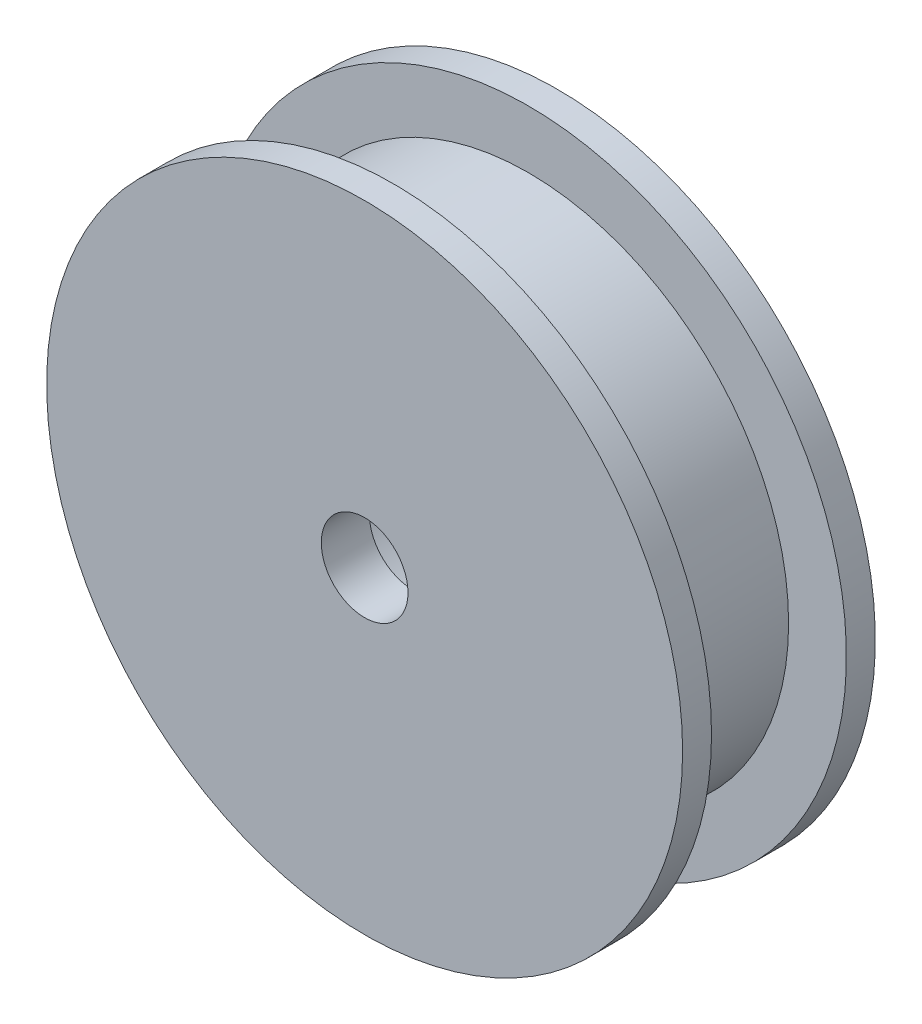
ISO-10303-21;
HEADER;
FILE_DESCRIPTION(('STEP AP214'),'2;1');
FILE_NAME('part.step','',(''),(''),'','','');
FILE_SCHEMA(('AUTOMOTIVE_DESIGN { 1 0 10303 214 1 1 1 1 }'));
ENDSEC;
DATA;
#1=APPLICATION_CONTEXT('core data for automotive mechanical design processes');
#2=APPLICATION_PROTOCOL_DEFINITION('international standard','automotive_design',2000,#1);
#3=PRODUCT_CONTEXT('',#1,'mechanical');
#4=PRODUCT('Part','Part','',(#3));
#5=PRODUCT_RELATED_PRODUCT_CATEGORY('part','',(#4));
#6=PRODUCT_DEFINITION_FORMATION('','',#4);
#7=PRODUCT_DEFINITION_CONTEXT('part definition',#1,'design');
#8=PRODUCT_DEFINITION('design','',#6,#7);
#9=PRODUCT_DEFINITION_SHAPE('','',#8);
#10=(LENGTH_UNIT() NAMED_UNIT(*) SI_UNIT(.MILLI.,.METRE.));
#11=(NAMED_UNIT(*) PLANE_ANGLE_UNIT() SI_UNIT($,.RADIAN.));
#12=(NAMED_UNIT(*) SI_UNIT($,.STERADIAN.) SOLID_ANGLE_UNIT());
#13=UNCERTAINTY_MEASURE_WITH_UNIT(LENGTH_MEASURE(1.E-05),#10,'distance_accuracy_value','');
#14=(GEOMETRIC_REPRESENTATION_CONTEXT(3) GLOBAL_UNCERTAINTY_ASSIGNED_CONTEXT((#13)) GLOBAL_UNIT_ASSIGNED_CONTEXT((#10,
#11,#12)) REPRESENTATION_CONTEXT('',''));
#15=CARTESIAN_POINT('',(0.,0.,0.));
#16=DIRECTION('',(0.,0.,1.));
#17=DIRECTION('',(1.,0.,0.));
#18=AXIS2_PLACEMENT_3D('',#15,#16,#17);
#19=CARTESIAN_POINT('',(0.,0.,-1.5));
#20=DIRECTION('',(0.,0.,1.));
#21=DIRECTION('',(1.,0.,0.));
#22=AXIS2_PLACEMENT_3D('',#19,#20,#21);
#23=CYLINDRICAL_SURFACE('',#22,6.5);
#24=CARTESIAN_POINT('',(0.,0.,-1.5));
#25=DIRECTION('',(0.,0.,1.));
#26=DIRECTION('',(1.,0.,0.));
#27=AXIS2_PLACEMENT_3D('',#24,#25,#26);
#28=CIRCLE('',#27,6.5);
#29=CARTESIAN_POINT('',(6.5,0.,-1.5));
#30=VERTEX_POINT('',#29);
#31=EDGE_CURVE('E58',#30,#30,#28,.T.);
#32=ORIENTED_EDGE('',*,*,#31,.F.);
#33=EDGE_LOOP('',(#32));
#34=FACE_BOUND('',#33,.T.);
#35=CARTESIAN_POINT('',(0.,0.,6.));
#36=DIRECTION('',(0.,0.,1.));
#37=DIRECTION('',(1.,0.,0.));
#38=AXIS2_PLACEMENT_3D('',#35,#36,#37);
#39=CIRCLE('',#38,6.5);
#40=CARTESIAN_POINT('',(6.5,0.,6.));
#41=VERTEX_POINT('',#40);
#42=EDGE_CURVE('E10',#41,#41,#39,.F.);
#43=ORIENTED_EDGE('',*,*,#42,.F.);
#44=EDGE_LOOP('',(#43));
#45=FACE_BOUND('',#44,.T.);
#46=ADVANCED_FACE('F31',(#34,#45),#23,.F.);
#47=CARTESIAN_POINT('',(0.,0.,7.));
#48=DIRECTION('',(0.,0.,-1.));
#49=DIRECTION('',(-1.,0.,0.));
#50=AXIS2_PLACEMENT_3D('',#47,#48,#49);
#51=CYLINDRICAL_SURFACE('',#50,13.5);
#52=CARTESIAN_POINT('',(0.,0.,7.));
#53=DIRECTION('',(0.,0.,1.));
#54=DIRECTION('',(1.,0.,0.));
#55=AXIS2_PLACEMENT_3D('',#52,#53,#54);
#56=CIRCLE('',#55,13.5);
#57=CARTESIAN_POINT('',(13.5,0.,7.));
#58=VERTEX_POINT('',#57);
#59=EDGE_CURVE('E38',#58,#58,#56,.T.);
#60=ORIENTED_EDGE('',*,*,#59,.F.);
#61=EDGE_LOOP('',(#60));
#62=FACE_BOUND('',#61,.T.);
#63=CARTESIAN_POINT('',(0.,0.,0.));
#64=DIRECTION('',(0.,0.,-1.));
#65=DIRECTION('',(-1.,0.,0.));
#66=AXIS2_PLACEMENT_3D('',#63,#64,#65);
#67=CIRCLE('',#66,13.5);
#68=CARTESIAN_POINT('',(-13.5,0.,0.));
#69=VERTEX_POINT('',#68);
#70=EDGE_CURVE('E50',#69,#69,#67,.T.);
#71=ORIENTED_EDGE('',*,*,#70,.F.);
#72=EDGE_LOOP('',(#71));
#73=FACE_BOUND('',#72,.T.);
#74=ADVANCED_FACE('F33',(#62,#73),#51,.T.);
#75=CARTESIAN_POINT('',(0.,0.,8.5));
#76=DIRECTION('',(0.,0.,-1.));
#77=DIRECTION('',(-1.,0.,0.));
#78=AXIS2_PLACEMENT_3D('',#75,#76,#77);
#79=CYLINDRICAL_SURFACE('',#78,16.5);
#80=CARTESIAN_POINT('',(0.,0.,8.5));
#81=DIRECTION('',(0.,0.,1.));
#82=DIRECTION('',(1.,0.,0.));
#83=AXIS2_PLACEMENT_3D('',#80,#81,#82);
#84=CIRCLE('',#83,16.5);
#85=CARTESIAN_POINT('',(16.5,0.,8.5));
#86=VERTEX_POINT('',#85);
#87=EDGE_CURVE('E42',#86,#86,#84,.T.);
#88=ORIENTED_EDGE('',*,*,#87,.F.);
#89=EDGE_LOOP('',(#88));
#90=FACE_BOUND('',#89,.T.);
#91=CARTESIAN_POINT('',(0.,0.,7.));
#92=DIRECTION('',(0.,0.,1.));
#93=DIRECTION('',(1.,0.,0.));
#94=AXIS2_PLACEMENT_3D('',#91,#92,#93);
#95=CIRCLE('',#94,16.5);
#96=CARTESIAN_POINT('',(16.5,0.,7.));
#97=VERTEX_POINT('',#96);
#98=EDGE_CURVE('E46',#97,#97,#95,.T.);
#99=ORIENTED_EDGE('',*,*,#98,.T.);
#100=EDGE_LOOP('',(#99));
#101=FACE_BOUND('',#100,.T.);
#102=ADVANCED_FACE('F81',(#90,#101),#79,.T.);
#103=CARTESIAN_POINT('',(0.,0.,8.5));
#104=DIRECTION('',(0.,0.,1.));
#105=DIRECTION('',(1.,0.,0.));
#106=AXIS2_PLACEMENT_3D('',#103,#104,#105);
#107=PLANE('',#106);
#108=ORIENTED_EDGE('',*,*,#87,.T.);
#109=EDGE_LOOP('',(#108));
#110=FACE_BOUND('',#109,.T.);
#111=CARTESIAN_POINT('',(0.,0.,8.5));
#112=DIRECTION('',(0.,0.,1.));
#113=DIRECTION('',(1.,0.,0.));
#114=AXIS2_PLACEMENT_3D('',#111,#112,#113);
#115=CIRCLE('',#114,2.25);
#116=CARTESIAN_POINT('',(2.25,0.,8.5));
#117=VERTEX_POINT('',#116);
#118=EDGE_CURVE('E64',#117,#117,#115,.T.);
#119=ORIENTED_EDGE('',*,*,#118,.F.);
#120=EDGE_LOOP('',(#119));
#121=FACE_BOUND('',#120,.T.);
#122=ADVANCED_FACE('F78',(#110,#121),#107,.T.);
#123=CARTESIAN_POINT('',(0.,0.,7.));
#124=DIRECTION('',(0.,0.,1.));
#125=DIRECTION('',(1.,0.,0.));
#126=AXIS2_PLACEMENT_3D('',#123,#124,#125);
#127=PLANE('',#126);
#128=ORIENTED_EDGE('',*,*,#59,.T.);
#129=EDGE_LOOP('',(#128));
#130=FACE_BOUND('',#129,.T.);
#131=ORIENTED_EDGE('',*,*,#98,.F.);
#132=EDGE_LOOP('',(#131));
#133=FACE_BOUND('',#132,.T.);
#134=ADVANCED_FACE('F80',(#130,#133),#127,.F.);
#135=CARTESIAN_POINT('',(0.,0.,-1.5));
#136=DIRECTION('',(0.,0.,1.));
#137=DIRECTION('',(1.,0.,0.));
#138=AXIS2_PLACEMENT_3D('',#135,#136,#137);
#139=CYLINDRICAL_SURFACE('',#138,16.5);
#140=CARTESIAN_POINT('',(0.,0.,-1.5));
#141=DIRECTION('',(0.,0.,-1.));
#142=DIRECTION('',(-1.,0.,0.));
#143=AXIS2_PLACEMENT_3D('',#140,#141,#142);
#144=CIRCLE('',#143,16.5);
#145=CARTESIAN_POINT('',(-16.5,0.,-1.5));
#146=VERTEX_POINT('',#145);
#147=EDGE_CURVE('E54',#146,#146,#144,.T.);
#148=ORIENTED_EDGE('',*,*,#147,.F.);
#149=EDGE_LOOP('',(#148));
#150=FACE_BOUND('',#149,.T.);
#151=CARTESIAN_POINT('',(0.,0.,0.));
#152=DIRECTION('',(0.,0.,-1.));
#153=DIRECTION('',(-1.,0.,0.));
#154=AXIS2_PLACEMENT_3D('',#151,#152,#153);
#155=CIRCLE('',#154,16.5);
#156=CARTESIAN_POINT('',(-16.5,0.,0.));
#157=VERTEX_POINT('',#156);
#158=EDGE_CURVE('E55',#157,#157,#155,.T.);
#159=ORIENTED_EDGE('',*,*,#158,.T.);
#160=EDGE_LOOP('',(#159));
#161=FACE_BOUND('',#160,.T.);
#162=ADVANCED_FACE('F88',(#150,#161),#139,.T.);
#163=CARTESIAN_POINT('',(0.,0.,-1.5));
#164=DIRECTION('',(0.,0.,-1.));
#165=DIRECTION('',(-1.,0.,0.));
#166=AXIS2_PLACEMENT_3D('',#163,#164,#165);
#167=PLANE('',#166);
#168=ORIENTED_EDGE('',*,*,#31,.T.);
#169=EDGE_LOOP('',(#168));
#170=FACE_BOUND('',#169,.T.);
#171=ORIENTED_EDGE('',*,*,#147,.T.);
#172=EDGE_LOOP('',(#171));
#173=FACE_BOUND('',#172,.T.);
#174=ADVANCED_FACE('F103',(#170,#173),#167,.T.);
#175=CARTESIAN_POINT('',(0.,0.,0.));
#176=DIRECTION('',(0.,0.,-1.));
#177=DIRECTION('',(-1.,0.,0.));
#178=AXIS2_PLACEMENT_3D('',#175,#176,#177);
#179=PLANE('',#178);
#180=ORIENTED_EDGE('',*,*,#70,.T.);
#181=EDGE_LOOP('',(#180));
#182=FACE_BOUND('',#181,.T.);
#183=ORIENTED_EDGE('',*,*,#158,.F.);
#184=EDGE_LOOP('',(#183));
#185=FACE_BOUND('',#184,.T.);
#186=ADVANCED_FACE('F106',(#182,#185),#179,.F.);
#187=CARTESIAN_POINT('',(0.,0.,6.));
#188=DIRECTION('',(0.,0.,1.));
#189=DIRECTION('',(1.,0.,0.));
#190=AXIS2_PLACEMENT_3D('',#187,#188,#189);
#191=PLANE('',#190);
#192=CARTESIAN_POINT('',(0.,0.,6.));
#193=DIRECTION('',(0.,0.,1.));
#194=DIRECTION('',(1.,0.,0.));
#195=AXIS2_PLACEMENT_3D('',#192,#193,#194);
#196=CIRCLE('',#195,2.25);
#197=CARTESIAN_POINT('',(2.25,0.,6.));
#198=VERTEX_POINT('',#197);
#199=EDGE_CURVE('E63',#198,#198,#196,.T.);
#200=ORIENTED_EDGE('',*,*,#199,.T.);
#201=EDGE_LOOP('',(#200));
#202=FACE_BOUND('',#201,.T.);
#203=ORIENTED_EDGE('',*,*,#42,.T.);
#204=EDGE_LOOP('',(#203));
#205=FACE_BOUND('',#204,.T.);
#206=ADVANCED_FACE('F70',(#202,#205),#191,.F.);
#207=CARTESIAN_POINT('',(0.,0.,6.));
#208=DIRECTION('',(0.,0.,1.));
#209=DIRECTION('',(1.,0.,0.));
#210=AXIS2_PLACEMENT_3D('',#207,#208,#209);
#211=CYLINDRICAL_SURFACE('',#210,2.25);
#212=ORIENTED_EDGE('',*,*,#199,.F.);
#213=EDGE_LOOP('',(#212));
#214=FACE_BOUND('',#213,.T.);
#215=ORIENTED_EDGE('',*,*,#118,.T.);
#216=EDGE_LOOP('',(#215));
#217=FACE_BOUND('',#216,.T.);
#218=ADVANCED_FACE('F72',(#214,#217),#211,.F.);
#219=CLOSED_SHELL('',(#46,#74,#102,#122,#134,#162,#174,#186,#206,#218));
#220=MANIFOLD_SOLID_BREP('B2',#219);
#221=ADVANCED_BREP_SHAPE_REPRESENTATION('',(#18,#220),#14);
#222=SHAPE_DEFINITION_REPRESENTATION(#9,#221);
ENDSEC;
END-ISO-10303-21;
